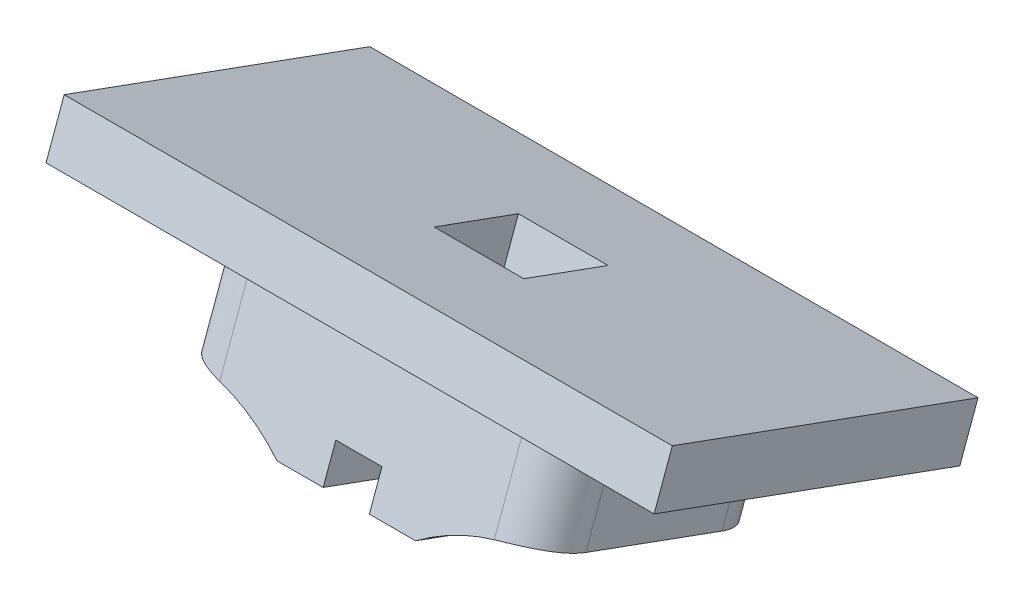
ISO-10303-21;
HEADER;
FILE_DESCRIPTION(('STEP AP214'),'2;1');
FILE_NAME('part.step','',(''),(''),'','','');
FILE_SCHEMA(('AUTOMOTIVE_DESIGN { 1 0 10303 214 1 1 1 1 }'));
ENDSEC;
DATA;
#1=APPLICATION_CONTEXT('core data for automotive mechanical design processes');
#2=APPLICATION_PROTOCOL_DEFINITION('international standard','automotive_design',2000,#1);
#3=PRODUCT_CONTEXT('',#1,'mechanical');
#4=PRODUCT('Part','Part','',(#3));
#5=PRODUCT_RELATED_PRODUCT_CATEGORY('part','',(#4));
#6=PRODUCT_DEFINITION_FORMATION('','',#4);
#7=PRODUCT_DEFINITION_CONTEXT('part definition',#1,'design');
#8=PRODUCT_DEFINITION('design','',#6,#7);
#9=PRODUCT_DEFINITION_SHAPE('','',#8);
#10=(LENGTH_UNIT() NAMED_UNIT(*) SI_UNIT(.MILLI.,.METRE.));
#11=(NAMED_UNIT(*) PLANE_ANGLE_UNIT() SI_UNIT($,.RADIAN.));
#12=(NAMED_UNIT(*) SI_UNIT($,.STERADIAN.) SOLID_ANGLE_UNIT());
#13=UNCERTAINTY_MEASURE_WITH_UNIT(LENGTH_MEASURE(1.E-05),#10,'distance_accuracy_value','');
#14=(GEOMETRIC_REPRESENTATION_CONTEXT(3) GLOBAL_UNCERTAINTY_ASSIGNED_CONTEXT((#13)) GLOBAL_UNIT_ASSIGNED_CONTEXT((#10,
#11,#12)) REPRESENTATION_CONTEXT('',''));
#15=CARTESIAN_POINT('',(0.,0.,0.));
#16=DIRECTION('',(0.,0.,1.));
#17=DIRECTION('',(1.,0.,0.));
#18=AXIS2_PLACEMENT_3D('',#15,#16,#17);
#19=CARTESIAN_POINT('',(-3.95,-153.983736472495,42.0443809768426));
#20=DIRECTION('',(0.,-0.34202014332567,-0.939692620785908));
#21=DIRECTION('',(0.,0.939692620785908,-0.34202014332567));
#22=AXIS2_PLACEMENT_3D('',#19,#20,#21);
#23=PLANE('',#22);
#24=CARTESIAN_POINT('',(2.99,-146.893345638401,39.4636897639186));
#25=DIRECTION('',(0.,-0.34202014332567,-0.939692620785908));
#26=DIRECTION('',(0.,0.939692620785908,-0.34202014332567));
#27=AXIS2_PLACEMENT_3D('',#24,#25,#26);
#28=CIRCLE('',#27,4.21306249999989);
#29=CARTESIAN_POINT('',(1.99,-143.047499821273,38.0639163609066));
#30=VERTEX_POINT('',#29);
#31=CARTESIAN_POINT('',(0.520000000000039,-143.68611599287,38.2963536384891));
#32=VERTEX_POINT('',#31);
#33=EDGE_CURVE('E63',#30,#32,#28,.F.);
#34=ORIENTED_EDGE('',*,*,#33,.F.);
#35=DIRECTION('',(0.,0.939692620785908,-0.34202014332567));
#36=VECTOR('',#35,1.);
#37=CARTESIAN_POINT('',(1.99,-153.983736472495,42.0443809768425));
#38=LINE('',#37,#36);
#39=CARTESIAN_POINT('',(1.99,-141.007992023631,37.321596230011));
#40=VERTEX_POINT('',#39);
#41=EDGE_CURVE('E368',#30,#40,#38,.T.);
#42=ORIENTED_EDGE('',*,*,#41,.T.);
#43=DIRECTION('',(-1.,0.,0.));
#44=VECTOR('',#43,1.);
#45=CARTESIAN_POINT('',(-3.95,-141.007992023631,37.321596230011));
#46=LINE('',#45,#44);
#47=CARTESIAN_POINT('',(-3.95,-141.007992023631,37.321596230011));
#48=VERTEX_POINT('',#47);
#49=EDGE_CURVE('E456',#40,#48,#46,.T.);
#50=ORIENTED_EDGE('',*,*,#49,.T.);
#51=DIRECTION('',(0.,0.939692620785908,-0.34202014332567));
#52=VECTOR('',#51,1.);
#53=CARTESIAN_POINT('',(-3.95,-153.983736472495,42.0443809768426));
#54=LINE('',#53,#52);
#55=CARTESIAN_POINT('',(-3.95,-143.047499821273,38.0639163609066));
#56=VERTEX_POINT('',#55);
#57=EDGE_CURVE('E459',#56,#48,#54,.T.);
#58=ORIENTED_EDGE('',*,*,#57,.F.);
#59=CARTESIAN_POINT('',(-4.95,-146.893345638401,39.4636897639186));
#60=DIRECTION('',(0.,-0.34202014332567,-0.939692620785908));
#61=DIRECTION('',(0.,0.939692620785908,-0.34202014332567));
#62=AXIS2_PLACEMENT_3D('',#59,#60,#61);
#63=CIRCLE('',#62,4.21306249999989);
#64=CARTESIAN_POINT('',(-2.48,-143.68611599287,38.2963536384891));
#65=VERTEX_POINT('',#64);
#66=EDGE_CURVE('E297',#56,#65,#63,.T.);
#67=ORIENTED_EDGE('',*,*,#66,.T.);
#68=DIRECTION('',(1.,0.,0.));
#69=VECTOR('',#68,1.);
#70=CARTESIAN_POINT('',(-3.95,-143.68611599287,38.2963536384891));
#71=LINE('',#70,#69);
#72=CARTESIAN_POINT('',(-1.48,-143.68611599287,38.2963536384892));
#73=VERTEX_POINT('',#72);
#74=EDGE_CURVE('E380',#65,#73,#71,.T.);
#75=ORIENTED_EDGE('',*,*,#74,.T.);
#76=DIRECTION('',(0.,0.939692620785908,-0.34202014332567));
#77=VECTOR('',#76,1.);
#78=CARTESIAN_POINT('',(-1.48,-153.983736472495,42.0443809768426));
#79=LINE('',#78,#77);
#80=CARTESIAN_POINT('',(-1.48,-142.934361896242,38.0227375238286));
#81=VERTEX_POINT('',#80);
#82=EDGE_CURVE('E430',#73,#81,#79,.T.);
#83=ORIENTED_EDGE('',*,*,#82,.T.);
#84=DIRECTION('',(1.,0.,0.));
#85=VECTOR('',#84,1.);
#86=CARTESIAN_POINT('',(-3.95,-142.934361896242,38.0227375238286));
#87=LINE('',#86,#85);
#88=CARTESIAN_POINT('',(-0.480000000000001,-142.934361896242,38.0227375238286));
#89=VERTEX_POINT('',#88);
#90=EDGE_CURVE('E437',#81,#89,#87,.T.);
#91=ORIENTED_EDGE('',*,*,#90,.T.);
#92=DIRECTION('',(0.,-0.939692620785908,0.34202014332567));
#93=VECTOR('',#92,1.);
#94=CARTESIAN_POINT('',(-0.480000000000001,-153.983736472495,42.0443809768426));
#95=LINE('',#94,#93);
#96=CARTESIAN_POINT('',(-0.480000000000001,-143.68611599287,38.2963536384892));
#97=VERTEX_POINT('',#96);
#98=EDGE_CURVE('E296',#89,#97,#95,.T.);
#99=ORIENTED_EDGE('',*,*,#98,.T.);
#100=EDGE_CURVE('E377',#97,#32,#71,.T.);
#101=ORIENTED_EDGE('',*,*,#100,.T.);
#102=EDGE_LOOP('',(#34,#42,#50,#58,#67,#75,#83,#91,#99,#101));
#103=FACE_BOUND('',#102,.T.);
#104=ADVANCED_FACE('F41',(#103),#23,.F.);
#105=CARTESIAN_POINT('',(1.99,-154.325756615821,41.1046883560566));
#106=DIRECTION('',(0.,0.939692620785908,-0.34202014332567));
#107=DIRECTION('',(0.,0.34202014332567,0.939692620785908));
#108=AXIS2_PLACEMENT_3D('',#105,#106,#107);
#109=CYLINDRICAL_SURFACE('',#108,1.);
#110=CARTESIAN_POINT('',(2.99,-143.276382039567,37.0830449030427));
#111=CARTESIAN_POINT('',(2.98999981089764,-143.266766275463,37.1094687338694));
#112=CARTESIAN_POINT('',(2.98881323349566,-143.257151901744,37.1358787397668));
#113=CARTESIAN_POINT('',(2.98407947173325,-143.237998388476,37.1885124140901));
#114=CARTESIAN_POINT('',(2.98053239500556,-143.228459245517,37.2147360909571));
#115=CARTESIAN_POINT('',(2.96638315016541,-143.200091374135,37.2928124313156));
#116=CARTESIAN_POINT('',(2.95227288035969,-143.181481932117,37.3441533382345));
#117=CARTESIAN_POINT('',(2.91508864291903,-143.14566984505,37.4440024947156));
#118=CARTESIAN_POINT('',(2.89201009605696,-143.128467924126,37.4925092825899));
#119=CARTESIAN_POINT('',(2.83755084831837,-143.096363377403,37.5854524737091));
#120=CARTESIAN_POINT('',(2.80617154510598,-143.081460365188,37.6298895605077));
#121=CARTESIAN_POINT('',(2.73610732829881,-143.054909582318,37.7134980419065));
#122=CARTESIAN_POINT('',(2.69743980668152,-143.043254222568,37.7526815997408));
#123=CARTESIAN_POINT('',(2.61390616137843,-143.024019049888,37.8249756617498));
#124=CARTESIAN_POINT('',(2.56904027416755,-143.016439081531,37.8580863974976));
#125=CARTESIAN_POINT('',(2.47495723246724,-143.006120763488,37.9171996392208));
#126=CARTESIAN_POINT('',(2.425786052357,-143.003336572144,37.9432674163578));
#127=CARTESIAN_POINT('',(2.32423345518072,-143.002930025805,37.9881995187241));
#128=CARTESIAN_POINT('',(2.27185268727984,-143.005306630324,38.0070652950719));
#129=CARTESIAN_POINT('',(2.18098361680717,-143.01390534125,38.0329154354904));
#130=CARTESIAN_POINT('',(2.14288144225,-143.018809304933,38.0417593434875));
#131=CARTESIAN_POINT('',(2.06647677901285,-143.031220395224,38.0556640177955));
#132=CARTESIAN_POINT('',(2.02817472137315,-143.038723239089,38.0607309651974));
#133=CARTESIAN_POINT('',(1.99,-143.047499821273,38.0639163609066));
#134=B_SPLINE_CURVE_WITH_KNOTS('',3,(#110,#111,#112,#113,#114,#115,#116,#117,#118,#119,#120,
#121,#122,#123,#124,#125,#126,#127,#128,#129,#130,#131,#132,#133),.UNSPECIFIED.,.F.,.F.,(4,2,2,
2,2,2,2,2,2,2,2,4),(0.,0.0843054131839694,0.168606982519992,0.336948632178146,0.505376350731905,
0.67377572780757,0.841778225334599,1.00977431513838,1.17615547140108,1.34250308610157,
1.46051200876002,1.57832738027521),.UNSPECIFIED.);
#135=CARTESIAN_POINT('',(2.99,-143.276382039567,37.0830449030427));
#136=VERTEX_POINT('',#135);
#137=EDGE_CURVE('E238',#136,#30,#134,.T.);
#138=ORIENTED_EDGE('',*,*,#137,.F.);
#139=DIRECTION('',(0.,0.939692620785908,-0.34202014332567));
#140=VECTOR('',#139,1.);
#141=CARTESIAN_POINT('',(2.99,-154.325756615821,41.1046883560566));
#142=LINE('',#141,#140);
#143=CARTESIAN_POINT('',(2.99,-141.350012166956,36.3819036092251));
#144=VERTEX_POINT('',#143);
#145=EDGE_CURVE('E357',#136,#144,#142,.T.);
#146=ORIENTED_EDGE('',*,*,#145,.T.);
#147=CARTESIAN_POINT('',(1.99,-141.350012166956,36.3819036092251));
#148=DIRECTION('',(0.,-0.939692620785908,0.34202014332567));
#149=DIRECTION('',(0.,-0.34202014332567,-0.939692620785908));
#150=AXIS2_PLACEMENT_3D('',#147,#148,#149);
#151=CIRCLE('',#150,1.);
#152=EDGE_CURVE('E453',#144,#40,#151,.T.);
#153=ORIENTED_EDGE('',*,*,#152,.T.);
#154=ORIENTED_EDGE('',*,*,#41,.F.);
#155=EDGE_LOOP('',(#138,#146,#153,#154));
#156=FACE_BOUND('',#155,.T.);
#157=ADVANCED_FACE('F336',(#156),#109,.T.);
#158=CARTESIAN_POINT('',(2.99,-154.325756615821,41.1046883560566));
#159=DIRECTION('',(-1.,0.,0.));
#160=DIRECTION('',(0.,0.,1.));
#161=AXIS2_PLACEMENT_3D('',#158,#159,#160);
#162=PLANE('',#161);
#163=DIRECTION('',(0.,-0.342020143325671,-0.939692620785908));
#164=VECTOR('',#163,1.);
#165=CARTESIAN_POINT('',(2.99,-142.456660956735,39.3352100683754));
#166=LINE('',#165,#164);
#167=CARTESIAN_POINT('',(2.99,-144.35032528961,34.1324100737749));
#168=VERTEX_POINT('',#167);
#169=EDGE_CURVE('E227',#136,#168,#166,.T.);
#170=ORIENTED_EDGE('',*,*,#169,.T.);
#171=DIRECTION('',(0.,0.939692620785908,-0.34202014332567));
#172=VECTOR('',#171,1.);
#173=CARTESIAN_POINT('',(2.99,-155.399699865863,38.1540535267889));
#174=LINE('',#173,#172);
#175=CARTESIAN_POINT('',(2.99,-142.423955416999,33.4312687799574));
#176=VERTEX_POINT('',#175);
#177=EDGE_CURVE('E355',#168,#176,#174,.T.);
#178=ORIENTED_EDGE('',*,*,#177,.T.);
#179=DIRECTION('',(0.,0.342020143325675,0.939692620785906));
#180=VECTOR('',#179,1.);
#181=CARTESIAN_POINT('',(2.99,-141.350012166956,36.3819036092251));
#182=LINE('',#181,#180);
#183=EDGE_CURVE('E451',#176,#144,#182,.T.);
#184=ORIENTED_EDGE('',*,*,#183,.T.);
#185=ORIENTED_EDGE('',*,*,#145,.F.);
#186=EDGE_LOOP('',(#170,#178,#184,#185));
#187=FACE_BOUND('',#186,.T.);
#188=ADVANCED_FACE('F342',(#187),#162,.F.);
#189=CARTESIAN_POINT('',(1.99,-155.399699865863,38.1540535267889));
#190=DIRECTION('',(0.,0.939692620785908,-0.34202014332567));
#191=DIRECTION('',(0.,0.34202014332567,0.939692620785908));
#192=AXIS2_PLACEMENT_3D('',#189,#190,#191);
#193=CYLINDRICAL_SURFACE('',#192,0.999999999999998);
#194=CARTESIAN_POINT('',(1.99,-144.805483357967,33.233896290067));
#195=CARTESIAN_POINT('',(2.01725761619237,-144.79922348073,33.2316180677604));
#196=CARTESIAN_POINT('',(2.04457165974824,-144.7928435343,33.2304826938889));
#197=CARTESIAN_POINT('',(2.09914786208946,-144.779859440297,33.2305260868529));
#198=CARTESIAN_POINT('',(2.1264100137061,-144.773255263829,33.2317051530578));
#199=CARTESIAN_POINT('',(2.20779213863848,-144.753149749551,33.2387511880115));
#200=CARTESIAN_POINT('',(2.26157759848621,-144.739339503021,33.2481210916792));
#201=CARTESIAN_POINT('',(2.36656171501325,-144.711004376272,33.2760700432339));
#202=CARTESIAN_POINT('',(2.41775676991294,-144.696478553597,33.2946615452832));
#203=CARTESIAN_POINT('',(2.51588163335734,-144.66673240589,33.3404833692873));
#204=CARTESIAN_POINT('',(2.56281342425212,-144.651512408635,33.3677096494819));
#205=CARTESIAN_POINT('',(2.65032210904979,-144.620544377223,33.4294269021542));
#206=CARTESIAN_POINT('',(2.69098110698207,-144.60480716575,33.4638070936905));
#207=CARTESIAN_POINT('',(2.7655640939362,-144.572523734595,33.5389294529488));
#208=CARTESIAN_POINT('',(2.79948603270638,-144.555977270542,33.5796735506444));
#209=CARTESIAN_POINT('',(2.85979047210982,-144.52194490655,33.6664543116165));
#210=CARTESIAN_POINT('',(2.88612610089257,-144.504453927119,33.7125215136138));
#211=CARTESIAN_POINT('',(2.93023164995961,-144.468683546491,33.8082935054319));
#212=CARTESIAN_POINT('',(2.9480054111142,-144.450404502837,33.8579966526126));
#213=CARTESIAN_POINT('',(2.97079683236869,-144.418457510203,33.9453140332749));
#214=CARTESIAN_POINT('',(2.97799094083285,-144.404927947071,33.9824264699303));
#215=CARTESIAN_POINT('',(2.98759387073147,-144.377714204718,34.0571597285099));
#216=CARTESIAN_POINT('',(2.99000824305152,-144.364030223434,34.0947799095675));
#217=CARTESIAN_POINT('',(2.99,-144.35032528961,34.1324100737749));
#218=B_SPLINE_CURVE_WITH_KNOTS('',3,(#194,#195,#196,#197,#198,#199,#200,#201,#202,#203,#204,
#205,#206,#207,#208,#209,#210,#211,#212,#213,#214,#215,#216,#217),.UNSPECIFIED.,.F.,.F.,(4,2,2,
2,2,2,2,2,2,2,2,4),(0.,0.084132329843378,0.168275542794132,0.336349102403102,0.504650273124573,
0.672872781548958,0.838661942125909,1.00450147934268,1.17134469250183,1.33811298961132,
1.4582926584267,1.5783326760511),.UNSPECIFIED.);
#219=CARTESIAN_POINT('',(1.99,-144.805483357967,33.233896290067));
#220=VERTEX_POINT('',#219);
#221=EDGE_CURVE('E230',#220,#168,#218,.T.);
#222=ORIENTED_EDGE('',*,*,#221,.F.);
#223=DIRECTION('',(0.,0.939692620785908,-0.34202014332567));
#224=VECTOR('',#223,1.);
#225=CARTESIAN_POINT('',(1.99,-155.741720009189,37.214360906003));
#226=LINE('',#225,#224);
#227=CARTESIAN_POINT('',(1.99,-142.765975560325,32.4915761591715));
#228=VERTEX_POINT('',#227);
#229=EDGE_CURVE('E364',#220,#228,#226,.T.);
#230=ORIENTED_EDGE('',*,*,#229,.T.);
#231=CARTESIAN_POINT('',(1.99,-142.423955416999,33.4312687799574));
#232=DIRECTION('',(0.,-0.939692620785908,0.34202014332567));
#233=DIRECTION('',(0.,-0.34202014332567,-0.939692620785908));
#234=AXIS2_PLACEMENT_3D('',#231,#232,#233);
#235=CIRCLE('',#234,0.999999999999998);
#236=EDGE_CURVE('E362',#228,#176,#235,.T.);
#237=ORIENTED_EDGE('',*,*,#236,.T.);
#238=ORIENTED_EDGE('',*,*,#177,.F.);
#239=EDGE_LOOP('',(#222,#230,#237,#238));
#240=FACE_BOUND('',#239,.T.);
#241=ADVANCED_FACE('F245',(#240),#193,.T.);
#242=CARTESIAN_POINT('',(-3.95,-155.741720009189,37.214360906003));
#243=DIRECTION('',(0.,0.34202014332567,0.939692620785908));
#244=DIRECTION('',(0.,-0.939692620785908,0.34202014332567));
#245=AXIS2_PLACEMENT_3D('',#242,#243,#244);
#246=PLANE('',#245);
#247=CARTESIAN_POINT('',(2.99,-148.651329175095,34.633669693079));
#248=DIRECTION('',(0.,0.34202014332567,0.939692620785908));
#249=DIRECTION('',(0.,0.939692620785908,-0.34202014332567));
#250=AXIS2_PLACEMENT_3D('',#247,#248,#249);
#251=CIRCLE('',#250,4.21306249999989);
#252=CARTESIAN_POINT('',(0.520000000000003,-145.444099529564,33.4663335676496));
#253=VERTEX_POINT('',#252);
#254=EDGE_CURVE('E223',#220,#253,#251,.T.);
#255=ORIENTED_EDGE('',*,*,#254,.T.);
#256=DIRECTION('',(-1.,0.,0.));
#257=VECTOR('',#256,1.);
#258=CARTESIAN_POINT('',(-3.95,-145.444099529564,33.4663335676496));
#259=LINE('',#258,#257);
#260=CARTESIAN_POINT('',(-0.480000000000001,-145.444099529564,33.4663335676496));
#261=VERTEX_POINT('',#260);
#262=EDGE_CURVE('E414',#253,#261,#259,.T.);
#263=ORIENTED_EDGE('',*,*,#262,.T.);
#264=DIRECTION('',(0.,-0.939692620785908,0.342020143325669));
#265=VECTOR('',#264,1.);
#266=CARTESIAN_POINT('',(-0.480000000000001,-145.444099529564,33.4663335676496));
#267=LINE('',#266,#265);
#268=CARTESIAN_POINT('',(-0.480000000000001,-144.692345432936,33.192717452989));
#269=VERTEX_POINT('',#268);
#270=EDGE_CURVE('E477',#269,#261,#267,.T.);
#271=ORIENTED_EDGE('',*,*,#270,.F.);
#272=DIRECTION('',(1.,0.,0.));
#273=VECTOR('',#272,1.);
#274=CARTESIAN_POINT('',(-1.48,-144.692345432936,33.192717452989));
#275=LINE('',#274,#273);
#276=CARTESIAN_POINT('',(-1.48,-144.692345432936,33.192717452989));
#277=VERTEX_POINT('',#276);
#278=EDGE_CURVE('E485',#277,#269,#275,.T.);
#279=ORIENTED_EDGE('',*,*,#278,.F.);
#280=DIRECTION('',(0.,0.939692620785908,-0.342020143325669));
#281=VECTOR('',#280,1.);
#282=CARTESIAN_POINT('',(-1.48,-145.444099529564,33.4663335676496));
#283=LINE('',#282,#281);
#284=CARTESIAN_POINT('',(-1.48,-145.444099529564,33.4663335676496));
#285=VERTEX_POINT('',#284);
#286=EDGE_CURVE('E484',#285,#277,#283,.T.);
#287=ORIENTED_EDGE('',*,*,#286,.F.);
#288=CARTESIAN_POINT('',(-2.48,-145.444099529564,33.4663335676496));
#289=VERTEX_POINT('',#288);
#290=EDGE_CURVE('E424',#285,#289,#259,.T.);
#291=ORIENTED_EDGE('',*,*,#290,.T.);
#292=CARTESIAN_POINT('',(-4.95,-148.651329175095,34.633669693079));
#293=DIRECTION('',(0.,-0.34202014332567,-0.939692620785908));
#294=DIRECTION('',(0.,0.939692620785908,-0.34202014332567));
#295=AXIS2_PLACEMENT_3D('',#292,#293,#294);
#296=CIRCLE('',#295,4.21306249999989);
#297=CARTESIAN_POINT('',(-3.95,-144.805483357967,33.233896290067));
#298=VERTEX_POINT('',#297);
#299=EDGE_CURVE('E483',#298,#289,#296,.T.);
#300=ORIENTED_EDGE('',*,*,#299,.F.);
#301=DIRECTION('',(0.,0.939692620785908,-0.34202014332567));
#302=VECTOR('',#301,1.);
#303=CARTESIAN_POINT('',(-3.95,-155.741720009189,37.214360906003));
#304=LINE('',#303,#302);
#305=CARTESIAN_POINT('',(-3.95,-142.765975560325,32.4915761591715));
#306=VERTEX_POINT('',#305);
#307=EDGE_CURVE('E366',#298,#306,#304,.T.);
#308=ORIENTED_EDGE('',*,*,#307,.T.);
#309=DIRECTION('',(1.,0.,0.));
#310=VECTOR('',#309,1.);
#311=CARTESIAN_POINT('',(-3.95,-142.765975560325,32.4915761591715));
#312=LINE('',#311,#310);
#313=EDGE_CURVE('E447',#306,#228,#312,.T.);
#314=ORIENTED_EDGE('',*,*,#313,.T.);
#315=ORIENTED_EDGE('',*,*,#229,.F.);
#316=EDGE_LOOP('',(#255,#263,#271,#279,#287,#291,#300,#308,#314,#315));
#317=FACE_BOUND('',#316,.T.);
#318=ADVANCED_FACE('F305',(#317),#246,.F.);
#319=CARTESIAN_POINT('',(22.85,-147.386773943654,28.1288794815856));
#320=DIRECTION('',(0.,0.939692620785908,-0.342020143325669));
#321=DIRECTION('',(0.,0.342020143325669,0.939692620785908));
#322=AXIS2_PLACEMENT_3D('',#319,#320,#321);
#323=PLANE('',#322);
#324=DIRECTION('',(0.,-0.342020143325671,-0.939692620785908));
#325=VECTOR('',#324,1.);
#326=CARTESIAN_POINT('',(0.520000000000037,-143.208415053364,39.6088261830359));
#327=LINE('',#326,#325);
#328=EDGE_CURVE('E12',#32,#253,#327,.T.);
#329=ORIENTED_EDGE('',*,*,#328,.F.);
#330=ORIENTED_EDGE('',*,*,#100,.F.);
#331=DIRECTION('',(0.,-0.342020143325669,-0.939692620785908));
#332=VECTOR('',#331,1.);
#333=CARTESIAN_POINT('',(-0.480000000000001,-147.386773943654,28.1288794815856));
#334=LINE('',#333,#332);
#335=EDGE_CURVE('E417',#97,#261,#334,.T.);
#336=ORIENTED_EDGE('',*,*,#335,.T.);
#337=ORIENTED_EDGE('',*,*,#262,.F.);
#338=EDGE_LOOP('',(#329,#330,#336,#337));
#339=FACE_BOUND('',#338,.T.);
#340=ADVANCED_FACE('F275',(#339),#323,.F.);
#341=ORIENTED_EDGE('',*,*,#290,.F.);
#342=DIRECTION('',(0.,0.342020143325669,0.939692620785908));
#343=VECTOR('',#342,1.);
#344=CARTESIAN_POINT('',(-1.48,-147.386773943654,28.1288794815856));
#345=LINE('',#344,#343);
#346=EDGE_CURVE('E49',#285,#73,#345,.T.);
#347=ORIENTED_EDGE('',*,*,#346,.T.);
#348=ORIENTED_EDGE('',*,*,#74,.F.);
#349=DIRECTION('',(0.,-0.34202014332567,-0.939692620785908));
#350=VECTOR('',#349,1.);
#351=CARTESIAN_POINT('',(-2.47999999999991,-117.524564653585,110.17462520108));
#352=LINE('',#351,#350);
#353=EDGE_CURVE('E401',#65,#289,#352,.T.);
#354=ORIENTED_EDGE('',*,*,#353,.T.);
#355=EDGE_LOOP('',(#341,#347,#348,#354));
#356=FACE_BOUND('',#355,.T.);
#357=ADVANCED_FACE('F327',(#356),#323,.F.);
#358=CARTESIAN_POINT('',(5.6,-157.256495729197,36.754725295823));
#359=DIRECTION('',(-1.,0.,0.));
#360=DIRECTION('',(0.,0.,1.));
#361=AXIS2_PLACEMENT_3D('',#358,#359,#360);
#362=PLANE('',#361);
#363=DIRECTION('',(0.,0.34202014332567,0.939692620785908));
#364=VECTOR('',#363,1.);
#365=CARTESIAN_POINT('',(5.6,-143.090894696484,31.5988681694248));
#366=LINE('',#365,#364);
#367=CARTESIAN_POINT('',(5.6,-143.090894696484,31.5988681694248));
#368=VERTEX_POINT('',#367);
#369=CARTESIAN_POINT('',(5.6,-140.683072887471,38.2143042197576));
#370=VERTEX_POINT('',#369);
#371=EDGE_CURVE('E405',#368,#370,#366,.T.);
#372=ORIENTED_EDGE('',*,*,#371,.F.);
#373=DIRECTION('',(0.,0.939692620785908,-0.342020143325669));
#374=VECTOR('',#373,1.);
#375=CARTESIAN_POINT('',(5.6,-157.256495729197,36.754725295823));
#376=LINE('',#375,#374);
#377=CARTESIAN_POINT('',(5.6,-142.01024818258,31.2055450046003));
#378=VERTEX_POINT('',#377);
#379=EDGE_CURVE('E397',#368,#378,#376,.T.);
#380=ORIENTED_EDGE('',*,*,#379,.T.);
#381=DIRECTION('',(0.,0.342020143325667,0.939692620785909));
#382=VECTOR('',#381,1.);
#383=CARTESIAN_POINT('',(5.6,-142.01024818258,31.2055450046003));
#384=LINE('',#383,#382);
#385=CARTESIAN_POINT('',(5.6,-139.602426373567,37.8209810549331));
#386=VERTEX_POINT('',#385);
#387=EDGE_CURVE('E394',#378,#386,#384,.T.);
#388=ORIENTED_EDGE('',*,*,#387,.T.);
#389=DIRECTION('',(0.,0.939692620785908,-0.342020143325669));
#390=VECTOR('',#389,1.);
#391=CARTESIAN_POINT('',(5.6,-154.848673920184,43.3701613461558));
#392=LINE('',#391,#390);
#393=EDGE_CURVE('E393',#370,#386,#392,.T.);
#394=ORIENTED_EDGE('',*,*,#393,.F.);
#395=EDGE_LOOP('',(#372,#380,#388,#394));
#396=FACE_BOUND('',#395,.T.);
#397=ADVANCED_FACE('F324',(#396),#362,.F.);
#398=CARTESIAN_POINT('',(5.6,-154.848673920184,43.3701613461558));
#399=DIRECTION('',(0.,-0.342020143325669,-0.939692620785908));
#400=DIRECTION('',(0.,0.939692620785908,-0.342020143325669));
#401=AXIS2_PLACEMENT_3D('',#398,#399,#400);
#402=PLANE('',#401);
#403=DIRECTION('',(-1.,0.,0.));
#404=VECTOR('',#403,1.);
#405=CARTESIAN_POINT('',(5.6,-140.683072887471,38.2143042197576));
#406=LINE('',#405,#404);
#407=CARTESIAN_POINT('',(-7.56000000000001,-140.683072887471,38.2143042197576));
#408=VERTEX_POINT('',#407);
#409=EDGE_CURVE('E402',#370,#408,#406,.T.);
#410=ORIENTED_EDGE('',*,*,#409,.F.);
#411=ORIENTED_EDGE('',*,*,#393,.T.);
#412=DIRECTION('',(-1.,0.,0.));
#413=VECTOR('',#412,1.);
#414=CARTESIAN_POINT('',(5.6,-139.602426373567,37.8209810549331));
#415=LINE('',#414,#413);
#416=CARTESIAN_POINT('',(-7.56000000000001,-139.602426373567,37.8209810549331));
#417=VERTEX_POINT('',#416);
#418=EDGE_CURVE('E390',#386,#417,#415,.T.);
#419=ORIENTED_EDGE('',*,*,#418,.T.);
#420=DIRECTION('',(0.,0.939692620785908,-0.342020143325669));
#421=VECTOR('',#420,1.);
#422=CARTESIAN_POINT('',(-7.56000000000001,-154.848673920184,43.3701613461558));
#423=LINE('',#422,#421);
#424=EDGE_CURVE('E389',#408,#417,#423,.T.);
#425=ORIENTED_EDGE('',*,*,#424,.F.);
#426=EDGE_LOOP('',(#410,#411,#419,#425));
#427=FACE_BOUND('',#426,.T.);
#428=ADVANCED_FACE('F321',(#427),#402,.F.);
#429=CARTESIAN_POINT('',(-7.56000000000001,-157.256495729197,36.754725295823));
#430=DIRECTION('',(1.,0.,0.));
#431=DIRECTION('',(0.,0.,-1.));
#432=AXIS2_PLACEMENT_3D('',#429,#430,#431);
#433=PLANE('',#432);
#434=DIRECTION('',(0.,-0.34202014332567,-0.939692620785908));
#435=VECTOR('',#434,1.);
#436=CARTESIAN_POINT('',(-7.56000000000001,-143.090894696484,31.5988681694248));
#437=LINE('',#436,#435);
#438=CARTESIAN_POINT('',(-7.56000000000001,-143.090894696484,31.5988681694248));
#439=VERTEX_POINT('',#438);
#440=EDGE_CURVE('E398',#408,#439,#437,.T.);
#441=ORIENTED_EDGE('',*,*,#440,.F.);
#442=ORIENTED_EDGE('',*,*,#424,.T.);
#443=DIRECTION('',(0.,-0.34202014332567,-0.939692620785908));
#444=VECTOR('',#443,1.);
#445=CARTESIAN_POINT('',(-7.56000000000001,-142.01024818258,31.2055450046003));
#446=LINE('',#445,#444);
#447=CARTESIAN_POINT('',(-7.56000000000001,-142.01024818258,31.2055450046003));
#448=VERTEX_POINT('',#447);
#449=EDGE_CURVE('E386',#417,#448,#446,.T.);
#450=ORIENTED_EDGE('',*,*,#449,.T.);
#451=DIRECTION('',(0.,0.939692620785908,-0.342020143325669));
#452=VECTOR('',#451,1.);
#453=CARTESIAN_POINT('',(-7.56000000000001,-157.256495729197,36.754725295823));
#454=LINE('',#453,#452);
#455=EDGE_CURVE('E385',#439,#448,#454,.T.);
#456=ORIENTED_EDGE('',*,*,#455,.F.);
#457=EDGE_LOOP('',(#441,#442,#450,#456));
#458=FACE_BOUND('',#457,.T.);
#459=ADVANCED_FACE('F317',(#458),#433,.F.);
#460=CARTESIAN_POINT('',(5.6,-157.256495729197,36.754725295823));
#461=DIRECTION('',(0.,0.342020143325669,0.939692620785908));
#462=DIRECTION('',(0.,-0.939692620785908,0.342020143325669));
#463=AXIS2_PLACEMENT_3D('',#460,#461,#462);
#464=PLANE('',#463);
#465=DIRECTION('',(1.,0.,0.));
#466=VECTOR('',#465,1.);
#467=CARTESIAN_POINT('',(5.6,-143.090894696484,31.5988681694248));
#468=LINE('',#467,#466);
#469=EDGE_CURVE('E384',#439,#368,#468,.T.);
#470=ORIENTED_EDGE('',*,*,#469,.F.);
#471=ORIENTED_EDGE('',*,*,#455,.T.);
#472=DIRECTION('',(1.,0.,0.));
#473=VECTOR('',#472,1.);
#474=CARTESIAN_POINT('',(5.6,-142.01024818258,31.2055450046003));
#475=LINE('',#474,#473);
#476=EDGE_CURVE('E381',#448,#378,#475,.T.);
#477=ORIENTED_EDGE('',*,*,#476,.T.);
#478=ORIENTED_EDGE('',*,*,#379,.F.);
#479=EDGE_LOOP('',(#470,#471,#477,#478));
#480=FACE_BOUND('',#479,.T.);
#481=ADVANCED_FACE('F314',(#480),#464,.F.);
#482=CARTESIAN_POINT('',(-2.33648141816357E-13,-135.427473675633,49.2915693197998));
#483=DIRECTION('',(0.,-0.939692620785909,0.342020143325668));
#484=DIRECTION('',(0.,-0.342020143325667,-0.939692620785909));
#485=AXIS2_PLACEMENT_3D('',#482,#483,#484);
#486=PLANE('',#485);
#487=DIRECTION('',(1.,0.,0.));
#488=VECTOR('',#487,1.);
#489=CARTESIAN_POINT('',(-1.95,-140.474577739048,35.424764871929));
#490=LINE('',#489,#488);
#491=CARTESIAN_POINT('',(-1.95,-140.474577739048,35.424764871929));
#492=VERTEX_POINT('',#491);
#493=CARTESIAN_POINT('',(-0.0100000000000018,-140.474577739048,35.424764871929));
#494=VERTEX_POINT('',#493);
#495=EDGE_CURVE('E205',#492,#494,#490,.T.);
#496=ORIENTED_EDGE('',*,*,#495,.F.);
#497=DIRECTION('',(0.,0.342020143325665,0.93969262078591));
#498=VECTOR('',#497,1.);
#499=CARTESIAN_POINT('',(-1.95,-140.474577739048,35.424764871929));
#500=LINE('',#499,#498);
#501=CARTESIAN_POINT('',(-1.95,-141.1380968171,33.6017611876044));
#502=VERTEX_POINT('',#501);
#503=EDGE_CURVE('E56',#502,#492,#500,.T.);
#504=ORIENTED_EDGE('',*,*,#503,.F.);
#505=DIRECTION('',(-1.,0.,0.));
#506=VECTOR('',#505,1.);
#507=CARTESIAN_POINT('',(-1.95,-141.1380968171,33.6017611876044));
#508=LINE('',#507,#506);
#509=CARTESIAN_POINT('',(-0.0100000000000018,-141.1380968171,33.6017611876044));
#510=VERTEX_POINT('',#509);
#511=EDGE_CURVE('E212',#510,#502,#508,.T.);
#512=ORIENTED_EDGE('',*,*,#511,.F.);
#513=DIRECTION('',(0.,-0.342020143325665,-0.93969262078591));
#514=VECTOR('',#513,1.);
#515=CARTESIAN_POINT('',(-0.0100000000000018,-140.474577739048,35.424764871929));
#516=LINE('',#515,#514);
#517=EDGE_CURVE('E195',#494,#510,#516,.T.);
#518=ORIENTED_EDGE('',*,*,#517,.F.);
#519=EDGE_LOOP('',(#496,#504,#512,#518));
#520=FACE_BOUND('',#519,.T.);
#521=ORIENTED_EDGE('',*,*,#387,.F.);
#522=ORIENTED_EDGE('',*,*,#476,.F.);
#523=ORIENTED_EDGE('',*,*,#449,.F.);
#524=ORIENTED_EDGE('',*,*,#418,.F.);
#525=EDGE_LOOP('',(#521,#522,#523,#524));
#526=FACE_BOUND('',#525,.T.);
#527=ADVANCED_FACE('F209',(#520,#526),#486,.F.);
#528=CARTESIAN_POINT('',(0.,-136.508120189536,49.6848924846247));
#529=DIRECTION('',(0.,-0.939692620785908,0.34202014332567));
#530=DIRECTION('',(0.,-0.34202014332567,-0.939692620785908));
#531=AXIS2_PLACEMENT_3D('',#528,#529,#530);
#532=PLANE('',#531);
#533=CARTESIAN_POINT('',(-3.95,-141.350012166956,36.3819036092251));
#534=DIRECTION('',(0.,-0.939692620785908,0.34202014332567));
#535=DIRECTION('',(0.,-0.34202014332567,-0.939692620785908));
#536=AXIS2_PLACEMENT_3D('',#533,#534,#535);
#537=CIRCLE('',#536,1.);
#538=CARTESIAN_POINT('',(-4.95,-141.350012166956,36.3819036092251));
#539=VERTEX_POINT('',#538);
#540=EDGE_CURVE('E438',#48,#539,#537,.T.);
#541=ORIENTED_EDGE('',*,*,#540,.F.);
#542=ORIENTED_EDGE('',*,*,#49,.F.);
#543=ORIENTED_EDGE('',*,*,#152,.F.);
#544=ORIENTED_EDGE('',*,*,#183,.F.);
#545=ORIENTED_EDGE('',*,*,#236,.F.);
#546=ORIENTED_EDGE('',*,*,#313,.F.);
#547=CARTESIAN_POINT('',(-3.95,-142.423955416999,33.4312687799574));
#548=DIRECTION('',(0.,-0.939692620785908,0.34202014332567));
#549=DIRECTION('',(0.,-0.34202014332567,-0.939692620785908));
#550=AXIS2_PLACEMENT_3D('',#547,#548,#549);
#551=CIRCLE('',#550,0.999999999999997);
#552=CARTESIAN_POINT('',(-4.95,-142.423955416999,33.4312687799574));
#553=VERTEX_POINT('',#552);
#554=EDGE_CURVE('E444',#553,#306,#551,.T.);
#555=ORIENTED_EDGE('',*,*,#554,.F.);
#556=DIRECTION('',(0.,-0.342020143325675,-0.939692620785906));
#557=VECTOR('',#556,1.);
#558=CARTESIAN_POINT('',(-4.95,-141.350012166956,36.3819036092251));
#559=LINE('',#558,#557);
#560=EDGE_CURVE('E441',#539,#553,#559,.T.);
#561=ORIENTED_EDGE('',*,*,#560,.F.);
#562=EDGE_LOOP('',(#541,#542,#543,#544,#545,#546,#555,#561));
#563=FACE_BOUND('',#562,.T.);
#564=ORIENTED_EDGE('',*,*,#469,.T.);
#565=ORIENTED_EDGE('',*,*,#371,.T.);
#566=ORIENTED_EDGE('',*,*,#409,.T.);
#567=ORIENTED_EDGE('',*,*,#440,.T.);
#568=EDGE_LOOP('',(#564,#565,#566,#567));
#569=FACE_BOUND('',#568,.T.);
#570=ADVANCED_FACE('F43',(#563,#569),#532,.T.);
#571=CARTESIAN_POINT('',(-3.95,-155.399699865863,38.1540535267889));
#572=DIRECTION('',(0.,0.939692620785908,-0.34202014332567));
#573=DIRECTION('',(0.,0.34202014332567,0.939692620785908));
#574=AXIS2_PLACEMENT_3D('',#571,#572,#573);
#575=CYLINDRICAL_SURFACE('',#574,0.999999999999997);
#576=ORIENTED_EDGE('',*,*,#307,.F.);
#577=CARTESIAN_POINT('',(-3.95,-144.805483357967,33.233896290067));
#578=CARTESIAN_POINT('',(-3.97725761619237,-144.79922348073,33.2316180677604));
#579=CARTESIAN_POINT('',(-4.00457165974824,-144.7928435343,33.2304826938889));
#580=CARTESIAN_POINT('',(-4.05914786208946,-144.779859440297,33.2305260868529));
#581=CARTESIAN_POINT('',(-4.0864100137061,-144.773255263829,33.2317051530578));
#582=CARTESIAN_POINT('',(-4.16779213863848,-144.753149749551,33.2387511880115));
#583=CARTESIAN_POINT('',(-4.22157759848621,-144.739339503021,33.2481210916792));
#584=CARTESIAN_POINT('',(-4.32656171501325,-144.711004376272,33.2760700432339));
#585=CARTESIAN_POINT('',(-4.37775676991294,-144.696478553597,33.2946615452832));
#586=CARTESIAN_POINT('',(-4.47588163335734,-144.66673240589,33.3404833692873));
#587=CARTESIAN_POINT('',(-4.52281342425212,-144.651512408635,33.3677096494819));
#588=CARTESIAN_POINT('',(-4.61032210904979,-144.620544377223,33.4294269021542));
#589=CARTESIAN_POINT('',(-4.65098110698208,-144.60480716575,33.4638070936905));
#590=CARTESIAN_POINT('',(-4.7255640939362,-144.572523734595,33.5389294529488));
#591=CARTESIAN_POINT('',(-4.75948603270638,-144.555977270542,33.5796735506444));
#592=CARTESIAN_POINT('',(-4.81979047210982,-144.52194490655,33.6664543116165));
#593=CARTESIAN_POINT('',(-4.84612610089257,-144.504453927119,33.7125215136138));
#594=CARTESIAN_POINT('',(-4.89023164995961,-144.468683546491,33.8082935054319));
#595=CARTESIAN_POINT('',(-4.9080054111142,-144.450404502837,33.8579966526126));
#596=CARTESIAN_POINT('',(-4.93079683236869,-144.418457510203,33.9453140332749));
#597=CARTESIAN_POINT('',(-4.93799094083285,-144.404927947071,33.9824264699303));
#598=CARTESIAN_POINT('',(-4.94759387073147,-144.377714204718,34.0571597285099));
#599=CARTESIAN_POINT('',(-4.95000824305152,-144.364030223434,34.0947799095675));
#600=CARTESIAN_POINT('',(-4.95,-144.35032528961,34.1324100737749));
#601=B_SPLINE_CURVE_WITH_KNOTS('',3,(#577,#578,#579,#580,#581,#582,#583,#584,#585,#586,#587,
#588,#589,#590,#591,#592,#593,#594,#595,#596,#597,#598,#599,#600),.UNSPECIFIED.,.F.,.F.,(4,2,2,
2,2,2,2,2,2,2,2,4),(0.,0.084132329843378,0.168275542794133,0.336349102403102,0.504650273124574,
0.67287278154896,0.838661942125918,1.00450147934268,1.17134469250184,1.33811298961132,
1.4582926584267,1.57833267605111),.UNSPECIFIED.);
#602=CARTESIAN_POINT('',(-4.95,-144.35032528961,34.132410073775));
#603=VERTEX_POINT('',#602);
#604=EDGE_CURVE('E288',#298,#603,#601,.T.);
#605=ORIENTED_EDGE('',*,*,#604,.T.);
#606=DIRECTION('',(0.,0.939692620785908,-0.34202014332567));
#607=VECTOR('',#606,1.);
#608=CARTESIAN_POINT('',(-4.95,-155.399699865863,38.1540535267889));
#609=LINE('',#608,#607);
#610=EDGE_CURVE('E373',#603,#553,#609,.T.);
#611=ORIENTED_EDGE('',*,*,#610,.T.);
#612=ORIENTED_EDGE('',*,*,#554,.T.);
#613=EDGE_LOOP('',(#576,#605,#611,#612));
#614=FACE_BOUND('',#613,.T.);
#615=ADVANCED_FACE('F299',(#614),#575,.T.);
#616=CARTESIAN_POINT('',(-4.95,-154.325756615821,41.1046883560566));
#617=DIRECTION('',(1.,0.,0.));
#618=DIRECTION('',(0.,1.,0.));
#619=AXIS2_PLACEMENT_3D('',#616,#617,#618);
#620=PLANE('',#619);
#621=ORIENTED_EDGE('',*,*,#610,.F.);
#622=DIRECTION('',(0.,-0.34202014332567,-0.939692620785908));
#623=VECTOR('',#622,1.);
#624=CARTESIAN_POINT('',(-4.95,-116.772810556956,109.901009086419));
#625=LINE('',#624,#623);
#626=CARTESIAN_POINT('',(-4.95,-143.276382039567,37.0830449030427));
#627=VERTEX_POINT('',#626);
#628=EDGE_CURVE('E482',#627,#603,#625,.T.);
#629=ORIENTED_EDGE('',*,*,#628,.F.);
#630=DIRECTION('',(0.,0.939692620785908,-0.34202014332567));
#631=VECTOR('',#630,1.);
#632=CARTESIAN_POINT('',(-4.95,-154.325756615821,41.1046883560566));
#633=LINE('',#632,#631);
#634=EDGE_CURVE('E375',#627,#539,#633,.T.);
#635=ORIENTED_EDGE('',*,*,#634,.T.);
#636=ORIENTED_EDGE('',*,*,#560,.T.);
#637=EDGE_LOOP('',(#621,#629,#635,#636));
#638=FACE_BOUND('',#637,.T.);
#639=ADVANCED_FACE('F303',(#638),#620,.F.);
#640=CARTESIAN_POINT('',(-3.95,-154.325756615821,41.1046883560566));
#641=DIRECTION('',(0.,0.939692620785908,-0.34202014332567));
#642=DIRECTION('',(0.,0.34202014332567,0.939692620785908));
#643=AXIS2_PLACEMENT_3D('',#640,#641,#642);
#644=CYLINDRICAL_SURFACE('',#643,1.);
#645=ORIENTED_EDGE('',*,*,#634,.F.);
#646=CARTESIAN_POINT('',(-4.95,-143.276382039567,37.0830449030427));
#647=CARTESIAN_POINT('',(-4.94999981089764,-143.266766275463,37.1094687338694));
#648=CARTESIAN_POINT('',(-4.94881323349566,-143.257151901744,37.1358787397668));
#649=CARTESIAN_POINT('',(-4.94407947173325,-143.237998388476,37.1885124140901));
#650=CARTESIAN_POINT('',(-4.94053239500556,-143.228459245517,37.2147360909571));
#651=CARTESIAN_POINT('',(-4.92638315016541,-143.200091374135,37.2928124313156));
#652=CARTESIAN_POINT('',(-4.91227288035969,-143.181481932117,37.3441533382345));
#653=CARTESIAN_POINT('',(-4.87508864291903,-143.14566984505,37.4440024947156));
#654=CARTESIAN_POINT('',(-4.85201009605696,-143.128467924126,37.4925092825899));
#655=CARTESIAN_POINT('',(-4.79755084831837,-143.096363377403,37.5854524737091));
#656=CARTESIAN_POINT('',(-4.76617154510598,-143.081460365188,37.6298895605077));
#657=CARTESIAN_POINT('',(-4.69610732829882,-143.054909582318,37.7134980419065));
#658=CARTESIAN_POINT('',(-4.65743980668152,-143.043254222568,37.7526815997408));
#659=CARTESIAN_POINT('',(-4.57390616137843,-143.024019049888,37.8249756617498));
#660=CARTESIAN_POINT('',(-4.52904027416755,-143.016439081531,37.8580863974976));
#661=CARTESIAN_POINT('',(-4.43495723246725,-143.006120763488,37.9171996392208));
#662=CARTESIAN_POINT('',(-4.385786052357,-143.003336572144,37.9432674163578));
#663=CARTESIAN_POINT('',(-4.28423345518073,-143.002930025805,37.9881995187241));
#664=CARTESIAN_POINT('',(-4.23185268727984,-143.005306630324,38.0070652950719));
#665=CARTESIAN_POINT('',(-4.14098361680718,-143.01390534125,38.0329154354904));
#666=CARTESIAN_POINT('',(-4.10288144225,-143.018809304933,38.0417593434875));
#667=CARTESIAN_POINT('',(-4.02647677901285,-143.031220395224,38.0556640177955));
#668=CARTESIAN_POINT('',(-3.98817472137315,-143.038723239089,38.0607309651974));
#669=CARTESIAN_POINT('',(-3.95,-143.047499821273,38.0639163609066));
#670=B_SPLINE_CURVE_WITH_KNOTS('',3,(#646,#647,#648,#649,#650,#651,#652,#653,#654,#655,#656,
#657,#658,#659,#660,#661,#662,#663,#664,#665,#666,#667,#668,#669),.UNSPECIFIED.,.F.,.F.,(4,2,2,
2,2,2,2,2,2,2,2,4),(0.,0.0843054131839759,0.168606982519992,0.336948632178145,0.505376350731919,
0.673775727807582,0.841778225334604,1.00977431513837,1.17615547140108,1.34250308610157,
1.46051200876003,1.57832738027521),.UNSPECIFIED.);
#671=EDGE_CURVE('E279',#627,#56,#670,.T.);
#672=ORIENTED_EDGE('',*,*,#671,.T.);
#673=ORIENTED_EDGE('',*,*,#57,.T.);
#674=ORIENTED_EDGE('',*,*,#540,.T.);
#675=EDGE_LOOP('',(#645,#672,#673,#674));
#676=FACE_BOUND('',#675,.T.);
#677=ADVANCED_FACE('F273',(#676),#644,.T.);
#678=CARTESIAN_POINT('',(-4.95,-120.731794299116,111.341961326509));
#679=DIRECTION('',(0.,-0.34202014332567,-0.939692620785908));
#680=DIRECTION('',(0.,0.939692620785908,-0.34202014332567));
#681=AXIS2_PLACEMENT_3D('',#678,#679,#680);
#682=CYLINDRICAL_SURFACE('',#681,4.21306249999989);
#683=ORIENTED_EDGE('',*,*,#299,.T.);
#684=ORIENTED_EDGE('',*,*,#353,.F.);
#685=ORIENTED_EDGE('',*,*,#66,.F.);
#686=ORIENTED_EDGE('',*,*,#671,.F.);
#687=ORIENTED_EDGE('',*,*,#628,.T.);
#688=ORIENTED_EDGE('',*,*,#604,.F.);
#689=EDGE_LOOP('',(#683,#684,#685,#686,#687,#688));
#690=FACE_BOUND('',#689,.T.);
#691=ADVANCED_FACE('F265',(#690),#682,.F.);
#692=CARTESIAN_POINT('',(-1.48,-116.772810556956,109.901009086419));
#693=DIRECTION('',(0.,0.939692620785908,-0.34202014332567));
#694=DIRECTION('',(0.,0.34202014332567,0.939692620785908));
#695=AXIS2_PLACEMENT_3D('',#692,#693,#694);
#696=PLANE('',#695);
#697=DIRECTION('',(0.,-0.34202014332567,-0.939692620785908));
#698=VECTOR('',#697,1.);
#699=CARTESIAN_POINT('',(-1.48,-116.772810556956,109.901009086419));
#700=LINE('',#699,#698);
#701=EDGE_CURVE('E472',#81,#277,#700,.T.);
#702=ORIENTED_EDGE('',*,*,#701,.T.);
#703=ORIENTED_EDGE('',*,*,#278,.T.);
#704=DIRECTION('',(0.,-0.34202014332567,-0.939692620785908));
#705=VECTOR('',#704,1.);
#706=CARTESIAN_POINT('',(-0.480000000000001,-116.772810556956,109.901009086419));
#707=LINE('',#706,#705);
#708=EDGE_CURVE('E471',#89,#269,#707,.T.);
#709=ORIENTED_EDGE('',*,*,#708,.F.);
#710=ORIENTED_EDGE('',*,*,#90,.F.);
#711=EDGE_LOOP('',(#702,#703,#709,#710));
#712=FACE_BOUND('',#711,.T.);
#713=ADVANCED_FACE('F262',(#712),#696,.F.);
#714=CARTESIAN_POINT('',(-1.48,-117.524564653585,110.17462520108));
#715=DIRECTION('',(-1.,0.,0.));
#716=DIRECTION('',(0.,0.,1.));
#717=AXIS2_PLACEMENT_3D('',#714,#715,#716);
#718=PLANE('',#717);
#719=ORIENTED_EDGE('',*,*,#346,.F.);
#720=ORIENTED_EDGE('',*,*,#286,.T.);
#721=ORIENTED_EDGE('',*,*,#701,.F.);
#722=ORIENTED_EDGE('',*,*,#82,.F.);
#723=EDGE_LOOP('',(#719,#720,#721,#722));
#724=FACE_BOUND('',#723,.T.);
#725=ADVANCED_FACE('F260',(#724),#718,.F.);
#726=CARTESIAN_POINT('',(-0.480000000000001,-117.524564653585,110.17462520108));
#727=DIRECTION('',(1.,0.,0.));
#728=DIRECTION('',(0.,0.,-1.));
#729=AXIS2_PLACEMENT_3D('',#726,#727,#728);
#730=PLANE('',#729);
#731=ORIENTED_EDGE('',*,*,#708,.T.);
#732=ORIENTED_EDGE('',*,*,#270,.T.);
#733=ORIENTED_EDGE('',*,*,#335,.F.);
#734=ORIENTED_EDGE('',*,*,#98,.F.);
#735=EDGE_LOOP('',(#731,#732,#733,#734));
#736=FACE_BOUND('',#735,.T.);
#737=ADVANCED_FACE('F255',(#736),#730,.F.);
#738=CARTESIAN_POINT('',(2.99,-146.415644698895,40.7761623084653));
#739=DIRECTION('',(0.,-0.342020143325671,-0.939692620785908));
#740=DIRECTION('',(0.,0.939692620785908,-0.342020143325671));
#741=AXIS2_PLACEMENT_3D('',#738,#739,#740);
#742=CYLINDRICAL_SURFACE('',#741,4.21306249999989);
#743=ORIENTED_EDGE('',*,*,#33,.T.);
#744=ORIENTED_EDGE('',*,*,#328,.T.);
#745=ORIENTED_EDGE('',*,*,#254,.F.);
#746=ORIENTED_EDGE('',*,*,#221,.T.);
#747=ORIENTED_EDGE('',*,*,#169,.F.);
#748=ORIENTED_EDGE('',*,*,#137,.T.);
#749=EDGE_LOOP('',(#743,#744,#745,#746,#747,#748));
#750=FACE_BOUND('',#749,.T.);
#751=ADVANCED_FACE('F249',(#750),#742,.F.);
#752=CARTESIAN_POINT('',(-1.95,-146.059710660191,37.4575870096453));
#753=DIRECTION('',(-1.,0.,0.));
#754=DIRECTION('',(0.,0.,1.));
#755=AXIS2_PLACEMENT_3D('',#752,#753,#754);
#756=PLANE('',#755);
#757=DIRECTION('',(0.,-0.34202014332567,-0.939692620785908));
#758=VECTOR('',#757,1.);
#759=CARTESIAN_POINT('',(-1.95,-143.01174781517,36.3482192589083));
#760=LINE('',#759,#758);
#761=CARTESIAN_POINT('',(-1.95,-143.01174781517,36.3482192589083));
#762=VERTEX_POINT('',#761);
#763=CARTESIAN_POINT('',(-1.95,-143.675266893222,34.5252155745837));
#764=VERTEX_POINT('',#763);
#765=EDGE_CURVE('E224',#762,#764,#760,.T.);
#766=ORIENTED_EDGE('',*,*,#765,.T.);
#767=DIRECTION('',(0.,0.939692620785909,-0.342020143325667));
#768=VECTOR('',#767,1.);
#769=CARTESIAN_POINT('',(-1.95,-146.723229738243,35.6345833253206));
#770=LINE('',#769,#768);
#771=EDGE_CURVE('E217',#764,#502,#770,.T.);
#772=ORIENTED_EDGE('',*,*,#771,.T.);
#773=ORIENTED_EDGE('',*,*,#503,.T.);
#774=DIRECTION('',(0.,0.939692620785909,-0.342020143325667));
#775=VECTOR('',#774,1.);
#776=CARTESIAN_POINT('',(-1.95,-146.059710660191,37.4575870096453));
#777=LINE('',#776,#775);
#778=EDGE_CURVE('E202',#762,#492,#777,.T.);
#779=ORIENTED_EDGE('',*,*,#778,.F.);
#780=EDGE_LOOP('',(#766,#772,#773,#779));
#781=FACE_BOUND('',#780,.T.);
#782=ADVANCED_FACE('F254',(#781),#756,.F.);
#783=CARTESIAN_POINT('',(-1.95,-146.723229738243,35.6345833253206));
#784=DIRECTION('',(0.,-0.342020143325667,-0.939692620785909));
#785=DIRECTION('',(0.,0.939692620785909,-0.342020143325667));
#786=AXIS2_PLACEMENT_3D('',#783,#784,#785);
#787=PLANE('',#786);
#788=DIRECTION('',(1.,0.,0.));
#789=VECTOR('',#788,1.);
#790=CARTESIAN_POINT('',(-1.95,-143.675266893222,34.5252155745837));
#791=LINE('',#790,#789);
#792=CARTESIAN_POINT('',(-0.0100000000000023,-143.675266893222,34.5252155745837));
#793=VERTEX_POINT('',#792);
#794=EDGE_CURVE('E661',#764,#793,#791,.T.);
#795=ORIENTED_EDGE('',*,*,#794,.T.);
#796=DIRECTION('',(0.,0.939692620785909,-0.342020143325667));
#797=VECTOR('',#796,1.);
#798=CARTESIAN_POINT('',(-0.0100000000000029,-146.723229738243,35.6345833253206));
#799=LINE('',#798,#797);
#800=EDGE_CURVE('E201',#793,#510,#799,.T.);
#801=ORIENTED_EDGE('',*,*,#800,.T.);
#802=ORIENTED_EDGE('',*,*,#511,.T.);
#803=ORIENTED_EDGE('',*,*,#771,.F.);
#804=EDGE_LOOP('',(#795,#801,#802,#803));
#805=FACE_BOUND('',#804,.T.);
#806=ADVANCED_FACE('F543',(#805),#787,.F.);
#807=CARTESIAN_POINT('',(-0.0100000000000029,-146.059710660191,37.4575870096453));
#808=DIRECTION('',(1.,0.,0.));
#809=DIRECTION('',(0.,1.,0.));
#810=AXIS2_PLACEMENT_3D('',#807,#808,#809);
#811=PLANE('',#810);
#812=DIRECTION('',(0.,0.34202014332567,0.939692620785908));
#813=VECTOR('',#812,1.);
#814=CARTESIAN_POINT('',(-0.0100000000000023,-143.01174781517,36.3482192589083));
#815=LINE('',#814,#813);
#816=CARTESIAN_POINT('',(-0.0100000000000023,-143.01174781517,36.3482192589083));
#817=VERTEX_POINT('',#816);
#818=EDGE_CURVE('E198',#793,#817,#815,.T.);
#819=ORIENTED_EDGE('',*,*,#818,.T.);
#820=DIRECTION('',(0.,0.939692620785909,-0.342020143325667));
#821=VECTOR('',#820,1.);
#822=CARTESIAN_POINT('',(-0.0100000000000029,-146.059710660191,37.4575870096453));
#823=LINE('',#822,#821);
#824=EDGE_CURVE('E190',#817,#494,#823,.T.);
#825=ORIENTED_EDGE('',*,*,#824,.T.);
#826=ORIENTED_EDGE('',*,*,#517,.T.);
#827=ORIENTED_EDGE('',*,*,#800,.F.);
#828=EDGE_LOOP('',(#819,#825,#826,#827));
#829=FACE_BOUND('',#828,.T.);
#830=ADVANCED_FACE('F192',(#829),#811,.F.);
#831=CARTESIAN_POINT('',(-1.95,-146.059710660191,37.4575870096453));
#832=DIRECTION('',(0.,0.342020143325667,0.939692620785909));
#833=DIRECTION('',(0.,-0.939692620785909,0.342020143325667));
#834=AXIS2_PLACEMENT_3D('',#831,#832,#833);
#835=PLANE('',#834);
#836=DIRECTION('',(-1.,0.,0.));
#837=VECTOR('',#836,1.);
#838=CARTESIAN_POINT('',(-1.95,-143.01174781517,36.3482192589083));
#839=LINE('',#838,#837);
#840=EDGE_CURVE('E221',#817,#762,#839,.T.);
#841=ORIENTED_EDGE('',*,*,#840,.T.);
#842=ORIENTED_EDGE('',*,*,#778,.T.);
#843=ORIENTED_EDGE('',*,*,#495,.T.);
#844=ORIENTED_EDGE('',*,*,#824,.F.);
#845=EDGE_LOOP('',(#841,#842,#843,#844));
#846=FACE_BOUND('',#845,.T.);
#847=ADVANCED_FACE('F206',(#846),#835,.F.);
#848=CARTESIAN_POINT('',(-1.48,-116.302964246563,109.729999014756));
#849=DIRECTION('',(0.,0.939692620785908,-0.34202014332567));
#850=DIRECTION('',(0.,0.34202014332567,0.939692620785908));
#851=AXIS2_PLACEMENT_3D('',#848,#849,#850);
#852=PLANE('',#851);
#853=ORIENTED_EDGE('',*,*,#765,.F.);
#854=ORIENTED_EDGE('',*,*,#840,.F.);
#855=ORIENTED_EDGE('',*,*,#818,.F.);
#856=ORIENTED_EDGE('',*,*,#794,.F.);
#857=EDGE_LOOP('',(#853,#854,#855,#856));
#858=FACE_BOUND('',#857,.T.);
#859=ADVANCED_FACE('F562',(#858),#852,.T.);
#860=CLOSED_SHELL('',(#104,#157,#188,#241,#318,#340,#357,#397,#428,#459,#481,#527,#570,#615,
#639,#677,#691,#713,#725,#737,#751,#782,#806,#830,#847,#859));
#861=MANIFOLD_SOLID_BREP('B2',#860);
#862=ADVANCED_BREP_SHAPE_REPRESENTATION('',(#18,#861),#14);
#863=SHAPE_DEFINITION_REPRESENTATION(#9,#862);
ENDSEC;
END-ISO-10303-21;
